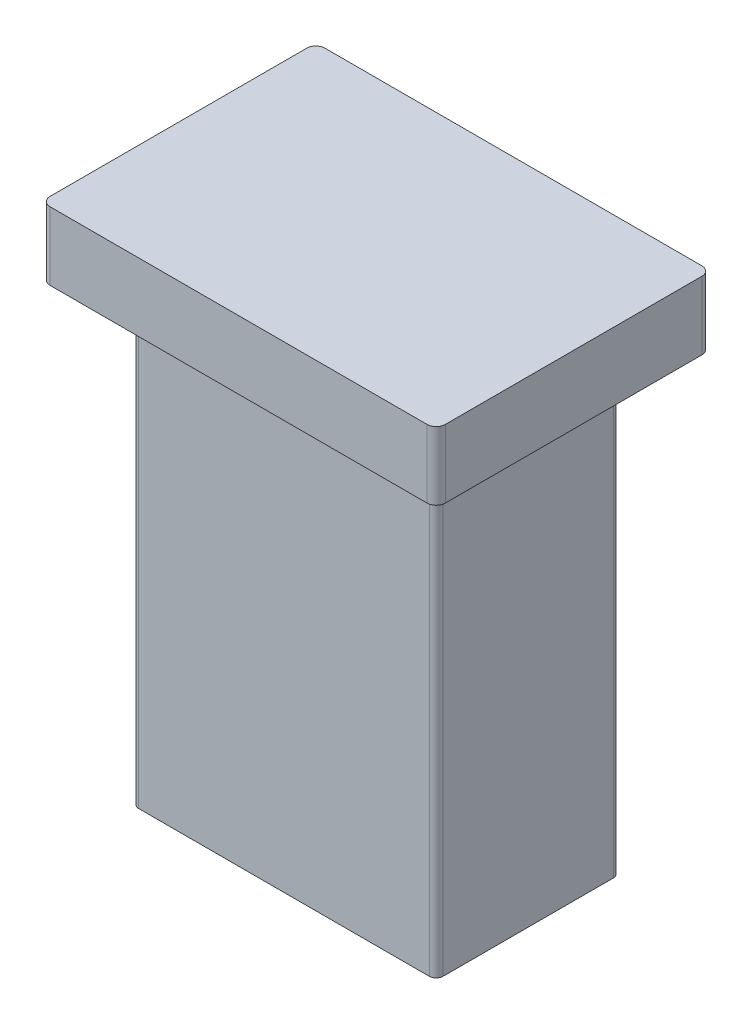
ISO-10303-21;
HEADER;
FILE_DESCRIPTION(('STEP AP214'),'2;1');
FILE_NAME('part.step','',(''),(''),'','','');
FILE_SCHEMA(('AUTOMOTIVE_DESIGN { 1 0 10303 214 1 1 1 1 }'));
ENDSEC;
DATA;
#1=APPLICATION_CONTEXT('core data for automotive mechanical design processes');
#2=APPLICATION_PROTOCOL_DEFINITION('international standard','automotive_design',2000,#1);
#3=PRODUCT_CONTEXT('',#1,'mechanical');
#4=PRODUCT('Part','Part','',(#3));
#5=PRODUCT_RELATED_PRODUCT_CATEGORY('part','',(#4));
#6=PRODUCT_DEFINITION_FORMATION('','',#4);
#7=PRODUCT_DEFINITION_CONTEXT('part definition',#1,'design');
#8=PRODUCT_DEFINITION('design','',#6,#7);
#9=PRODUCT_DEFINITION_SHAPE('','',#8);
#10=(LENGTH_UNIT() NAMED_UNIT(*) SI_UNIT(.MILLI.,.METRE.));
#11=(NAMED_UNIT(*) PLANE_ANGLE_UNIT() SI_UNIT($,.RADIAN.));
#12=(NAMED_UNIT(*) SI_UNIT($,.STERADIAN.) SOLID_ANGLE_UNIT());
#13=UNCERTAINTY_MEASURE_WITH_UNIT(LENGTH_MEASURE(1.E-05),#10,'distance_accuracy_value','');
#14=(GEOMETRIC_REPRESENTATION_CONTEXT(3) GLOBAL_UNCERTAINTY_ASSIGNED_CONTEXT((#13)) GLOBAL_UNIT_ASSIGNED_CONTEXT((#10,
#11,#12)) REPRESENTATION_CONTEXT('',''));
#15=CARTESIAN_POINT('',(0.,0.,0.));
#16=DIRECTION('',(0.,0.,1.));
#17=DIRECTION('',(1.,0.,0.));
#18=AXIS2_PLACEMENT_3D('',#15,#16,#17);
#19=CARTESIAN_POINT('',(-8.49999999999997,4.02455846426619E-13,5.25));
#20=DIRECTION('',(-1.,0.,0.));
#21=DIRECTION('',(0.,-1.,0.));
#22=AXIS2_PLACEMENT_3D('',#19,#20,#21);
#23=PLANE('',#22);
#24=DIRECTION('',(0.,-1.,0.));
#25=VECTOR('',#24,1.);
#26=CARTESIAN_POINT('',(-8.49999999999997,4.02455846426619E-13,3.75));
#27=LINE('',#26,#25);
#28=CARTESIAN_POINT('',(-8.50000000000071,-105.,3.75));
#29=VERTEX_POINT('',#28);
#30=CARTESIAN_POINT('',(-8.50000000000002,-6.99999999999994,3.75));
#31=VERTEX_POINT('',#30);
#32=EDGE_CURVE('E882',#29,#31,#27,.F.);
#33=ORIENTED_EDGE('',*,*,#32,.T.);
#34=DIRECTION('',(0.,0.,1.));
#35=VECTOR('',#34,1.);
#36=CARTESIAN_POINT('',(-8.50000000000002,-6.99999999999994,5.25));
#37=LINE('',#36,#35);
#38=CARTESIAN_POINT('',(-8.50000000000002,-6.99999999999994,-33.75));
#39=VERTEX_POINT('',#38);
#40=EDGE_CURVE('E485',#31,#39,#37,.F.);
#41=ORIENTED_EDGE('',*,*,#40,.T.);
#42=DIRECTION('',(0.,-1.,0.));
#43=VECTOR('',#42,1.);
#44=CARTESIAN_POINT('',(-8.49999999999997,4.02455846426619E-13,-33.75));
#45=LINE('',#44,#43);
#46=CARTESIAN_POINT('',(-8.50000000000071,-105.,-33.75));
#47=VERTEX_POINT('',#46);
#48=EDGE_CURVE('E879',#39,#47,#45,.T.);
#49=ORIENTED_EDGE('',*,*,#48,.T.);
#50=DIRECTION('',(0.,0.,-1.));
#51=VECTOR('',#50,1.);
#52=CARTESIAN_POINT('',(-8.50000000000071,-105.,5.25));
#53=LINE('',#52,#51);
#54=EDGE_CURVE('E909',#29,#47,#53,.T.);
#55=ORIENTED_EDGE('',*,*,#54,.F.);
#56=EDGE_LOOP('',(#33,#41,#49,#55));
#57=FACE_BOUND('',#56,.T.);
#58=ADVANCED_FACE('F49',(#57),#23,.T.);
#59=CARTESIAN_POINT('',(58.5,0.,5.25));
#60=DIRECTION('',(0.,0.,1.));
#61=DIRECTION('',(1.,0.,0.));
#62=AXIS2_PLACEMENT_3D('',#59,#60,#61);
#63=PLANE('',#62);
#64=DIRECTION('',(0.,-1.,0.));
#65=VECTOR('',#64,1.);
#66=CARTESIAN_POINT('',(57.,0.,5.25));
#67=LINE('',#66,#65);
#68=CARTESIAN_POINT('',(56.9999999999993,-105.,5.25));
#69=VERTEX_POINT('',#68);
#70=CARTESIAN_POINT('',(57.,-7.0000000000004,5.25));
#71=VERTEX_POINT('',#70);
#72=EDGE_CURVE('E849',#69,#71,#67,.F.);
#73=ORIENTED_EDGE('',*,*,#72,.T.);
#74=DIRECTION('',(1.,0.,0.));
#75=VECTOR('',#74,1.);
#76=CARTESIAN_POINT('',(58.5,-7.00000000000041,5.25));
#77=LINE('',#76,#75);
#78=CARTESIAN_POINT('',(-7.00000000000002,-6.99999999999995,5.25));
#79=VERTEX_POINT('',#78);
#80=EDGE_CURVE('E479',#71,#79,#77,.F.);
#81=ORIENTED_EDGE('',*,*,#80,.T.);
#82=DIRECTION('',(0.,-1.,0.));
#83=VECTOR('',#82,1.);
#84=CARTESIAN_POINT('',(-6.99999999999997,4.01872904157193E-13,5.25));
#85=LINE('',#84,#83);
#86=CARTESIAN_POINT('',(-7.00000000000071,-105.,5.25));
#87=VERTEX_POINT('',#86);
#88=EDGE_CURVE('E856',#79,#87,#85,.T.);
#89=ORIENTED_EDGE('',*,*,#88,.T.);
#90=DIRECTION('',(-1.,0.,0.));
#91=VECTOR('',#90,1.);
#92=CARTESIAN_POINT('',(58.4999999999993,-105.,5.25));
#93=LINE('',#92,#91);
#94=EDGE_CURVE('E854',#69,#87,#93,.T.);
#95=ORIENTED_EDGE('',*,*,#94,.F.);
#96=EDGE_LOOP('',(#73,#81,#89,#95));
#97=FACE_BOUND('',#96,.T.);
#98=ADVANCED_FACE('F344',(#97),#63,.T.);
#99=CARTESIAN_POINT('',(58.5,0.,5.25));
#100=DIRECTION('',(1.,0.,0.));
#101=DIRECTION('',(0.,1.,0.));
#102=AXIS2_PLACEMENT_3D('',#99,#100,#101);
#103=PLANE('',#102);
#104=DIRECTION('',(0.,-1.,0.));
#105=VECTOR('',#104,1.);
#106=CARTESIAN_POINT('',(58.5,0.,-33.75));
#107=LINE('',#106,#105);
#108=CARTESIAN_POINT('',(58.4999999999993,-105.,-33.75));
#109=VERTEX_POINT('',#108);
#110=CARTESIAN_POINT('',(58.5,-7.00000000000041,-33.75));
#111=VERTEX_POINT('',#110);
#112=EDGE_CURVE('E886',#109,#111,#107,.F.);
#113=ORIENTED_EDGE('',*,*,#112,.T.);
#114=DIRECTION('',(0.,0.,-1.));
#115=VECTOR('',#114,1.);
#116=CARTESIAN_POINT('',(58.5,-7.00000000000041,5.25));
#117=LINE('',#116,#115);
#118=CARTESIAN_POINT('',(58.5,-7.00000000000041,3.75));
#119=VERTEX_POINT('',#118);
#120=EDGE_CURVE('E473',#111,#119,#117,.F.);
#121=ORIENTED_EDGE('',*,*,#120,.T.);
#122=DIRECTION('',(0.,-1.,0.));
#123=VECTOR('',#122,1.);
#124=CARTESIAN_POINT('',(58.5,0.,3.75));
#125=LINE('',#124,#123);
#126=CARTESIAN_POINT('',(58.4999999999993,-105.,3.75));
#127=VERTEX_POINT('',#126);
#128=EDGE_CURVE('E850',#119,#127,#125,.T.);
#129=ORIENTED_EDGE('',*,*,#128,.T.);
#130=DIRECTION('',(0.,0.,1.));
#131=VECTOR('',#130,1.);
#132=CARTESIAN_POINT('',(58.4999999999993,-105.,5.25));
#133=LINE('',#132,#131);
#134=EDGE_CURVE('E862',#109,#127,#133,.T.);
#135=ORIENTED_EDGE('',*,*,#134,.F.);
#136=EDGE_LOOP('',(#113,#121,#129,#135));
#137=FACE_BOUND('',#136,.T.);
#138=ADVANCED_FACE('F347',(#137),#103,.T.);
#139=CARTESIAN_POINT('',(58.5,0.,-35.25));
#140=DIRECTION('',(0.,0.,-1.));
#141=DIRECTION('',(-1.,0.,0.));
#142=AXIS2_PLACEMENT_3D('',#139,#140,#141);
#143=PLANE('',#142);
#144=DIRECTION('',(0.,-1.,0.));
#145=VECTOR('',#144,1.);
#146=CARTESIAN_POINT('',(-6.99999999999996,4.01872904157193E-13,-35.25));
#147=LINE('',#146,#145);
#148=CARTESIAN_POINT('',(-7.00000000000071,-105.,-35.25));
#149=VERTEX_POINT('',#148);
#150=CARTESIAN_POINT('',(-7.00000000000001,-6.99999999999995,-35.25));
#151=VERTEX_POINT('',#150);
#152=EDGE_CURVE('E892',#149,#151,#147,.F.);
#153=ORIENTED_EDGE('',*,*,#152,.T.);
#154=DIRECTION('',(-1.,0.,0.));
#155=VECTOR('',#154,1.);
#156=CARTESIAN_POINT('',(58.5,-7.00000000000041,-35.25));
#157=LINE('',#156,#155);
#158=CARTESIAN_POINT('',(57.,-7.0000000000004,-35.25));
#159=VERTEX_POINT('',#158);
#160=EDGE_CURVE('E514',#151,#159,#157,.F.);
#161=ORIENTED_EDGE('',*,*,#160,.T.);
#162=DIRECTION('',(0.,-1.,0.));
#163=VECTOR('',#162,1.);
#164=CARTESIAN_POINT('',(57.,0.,-35.25));
#165=LINE('',#164,#163);
#166=CARTESIAN_POINT('',(56.9999999999993,-105.,-35.25));
#167=VERTEX_POINT('',#166);
#168=EDGE_CURVE('E438',#159,#167,#165,.T.);
#169=ORIENTED_EDGE('',*,*,#168,.T.);
#170=DIRECTION('',(1.,0.,0.));
#171=VECTOR('',#170,1.);
#172=CARTESIAN_POINT('',(58.4999999999993,-105.,-35.25));
#173=LINE('',#172,#171);
#174=EDGE_CURVE('E900',#149,#167,#173,.T.);
#175=ORIENTED_EDGE('',*,*,#174,.F.);
#176=EDGE_LOOP('',(#153,#161,#169,#175));
#177=FACE_BOUND('',#176,.T.);
#178=ADVANCED_FACE('F342',(#177),#143,.T.);
#179=CARTESIAN_POINT('',(-7.17709473941449E-13,-105.,0.));
#180=DIRECTION('',(0.,1.,0.));
#181=DIRECTION('',(-1.,0.,0.));
#182=AXIS2_PLACEMENT_3D('',#179,#180,#181);
#183=PLANE('',#182);
#184=DIRECTION('',(1.,0.,0.));
#185=VECTOR('',#184,1.);
#186=CARTESIAN_POINT('',(-7.00000000000073,-105.,-33.75));
#187=LINE('',#186,#185);
#188=CARTESIAN_POINT('',(-7.00000000000073,-105.,-33.75));
#189=VERTEX_POINT('',#188);
#190=CARTESIAN_POINT('',(56.9999999999993,-105.,-33.75));
#191=VERTEX_POINT('',#190);
#192=EDGE_CURVE('E914',#189,#191,#187,.T.);
#193=ORIENTED_EDGE('',*,*,#192,.F.);
#194=DIRECTION('',(0.,0.,-1.));
#195=VECTOR('',#194,1.);
#196=CARTESIAN_POINT('',(-7.00000000000073,-105.,-33.75));
#197=LINE('',#196,#195);
#198=CARTESIAN_POINT('',(-7.00000000000073,-105.,3.74999999999999));
#199=VERTEX_POINT('',#198);
#200=EDGE_CURVE('E925',#199,#189,#197,.T.);
#201=ORIENTED_EDGE('',*,*,#200,.F.);
#202=DIRECTION('',(-1.,0.,0.));
#203=VECTOR('',#202,1.);
#204=CARTESIAN_POINT('',(-7.00000000000073,-105.,3.74999999999999));
#205=LINE('',#204,#203);
#206=CARTESIAN_POINT('',(56.9999999999993,-105.,3.75));
#207=VERTEX_POINT('',#206);
#208=EDGE_CURVE('E236',#207,#199,#205,.T.);
#209=ORIENTED_EDGE('',*,*,#208,.F.);
#210=DIRECTION('',(0.,0.,1.));
#211=VECTOR('',#210,1.);
#212=CARTESIAN_POINT('',(56.9999999999993,-105.,-33.75));
#213=LINE('',#212,#211);
#214=EDGE_CURVE('E918',#191,#207,#213,.T.);
#215=ORIENTED_EDGE('',*,*,#214,.F.);
#216=EDGE_LOOP('',(#193,#201,#209,#215));
#217=FACE_BOUND('',#216,.T.);
#218=ORIENTED_EDGE('',*,*,#94,.T.);
#219=CARTESIAN_POINT('',(-7.0000000000007,-105.,3.75));
#220=DIRECTION('',(0.,1.,0.));
#221=DIRECTION('',(-1.,0.,0.));
#222=AXIS2_PLACEMENT_3D('',#219,#220,#221);
#223=CIRCLE('',#222,1.5);
#224=EDGE_CURVE('E876',#87,#29,#223,.F.);
#225=ORIENTED_EDGE('',*,*,#224,.T.);
#226=ORIENTED_EDGE('',*,*,#54,.T.);
#227=CARTESIAN_POINT('',(-7.0000000000007,-105.,-33.75));
#228=DIRECTION('',(0.,1.,0.));
#229=DIRECTION('',(-1.,0.,0.));
#230=AXIS2_PLACEMENT_3D('',#227,#228,#229);
#231=CIRCLE('',#230,1.5);
#232=EDGE_CURVE('E860',#47,#149,#231,.F.);
#233=ORIENTED_EDGE('',*,*,#232,.T.);
#234=ORIENTED_EDGE('',*,*,#174,.T.);
#235=CARTESIAN_POINT('',(56.9999999999993,-105.,-33.75));
#236=DIRECTION('',(0.,1.,0.));
#237=DIRECTION('',(-1.,0.,0.));
#238=AXIS2_PLACEMENT_3D('',#235,#236,#237);
#239=CIRCLE('',#238,1.5);
#240=EDGE_CURVE('E870',#167,#109,#239,.F.);
#241=ORIENTED_EDGE('',*,*,#240,.T.);
#242=ORIENTED_EDGE('',*,*,#134,.T.);
#243=CARTESIAN_POINT('',(56.9999999999993,-105.,3.75));
#244=DIRECTION('',(0.,1.,0.));
#245=DIRECTION('',(-1.,0.,0.));
#246=AXIS2_PLACEMENT_3D('',#243,#244,#245);
#247=CIRCLE('',#246,1.5);
#248=EDGE_CURVE('E873',#127,#69,#247,.F.);
#249=ORIENTED_EDGE('',*,*,#248,.T.);
#250=EDGE_LOOP('',(#218,#225,#226,#233,#234,#241,#242,#249));
#251=FACE_BOUND('',#250,.T.);
#252=ADVANCED_FACE('F272',(#217,#251),#183,.F.);
#253=CARTESIAN_POINT('',(0.,0.,0.));
#254=CARTESIAN_POINT('',(-2.61921824104236,-3.17616720955481,1.47627578718784));
#255=CARTESIAN_POINT('',(-8.18445347407178,-20.4129286031587,4.53132616889324));
#256=CARTESIAN_POINT('',(-4.85989916303547,-50.2491120364394,2.35522903024389));
#257=CARTESIAN_POINT('',(-7.2377355034017,-81.6238908082817,3.55458602145176));
#258=CARTESIAN_POINT('',(-7.13327503643624,-98.3304184884447,3.68328961066001));
#259=CARTESIAN_POINT('',(-7.00000000000073,-105.,3.75));
#260=CARTESIAN_POINT('',(0.,0.,-10.));
#261=CARTESIAN_POINT('',(-2.61921824104236,-3.17616720955481,-9.50790807093738));
#262=CARTESIAN_POINT('',(-8.18445347407178,-20.4129286031587,-8.48955794370225));
#263=CARTESIAN_POINT('',(-4.85989916303547,-50.2491120364394,-9.21492365658538));
#264=CARTESIAN_POINT('',(-7.2377355034017,-81.6238908082817,-8.81513799284942));
#265=CARTESIAN_POINT('',(-7.13327503643624,-98.3304184884447,-8.77223679644666));
#266=CARTESIAN_POINT('',(-7.00000000000073,-105.,-8.75));
#267=CARTESIAN_POINT('',(0.,0.,-20.));
#268=CARTESIAN_POINT('',(-2.61921824104236,-3.17616720955481,-20.4920919290626));
#269=CARTESIAN_POINT('',(-8.18445347407177,-20.4129286031587,-21.5104420562977));
#270=CARTESIAN_POINT('',(-4.85989916303547,-50.2491120364394,-20.7850763434146));
#271=CARTESIAN_POINT('',(-7.23773550340169,-81.6238908082817,-21.1848620071506));
#272=CARTESIAN_POINT('',(-7.13327503643624,-98.3304184884447,-21.2277632035533));
#273=CARTESIAN_POINT('',(-7.00000000000073,-105.,-21.25));
#274=CARTESIAN_POINT('',(0.,0.,-30.));
#275=CARTESIAN_POINT('',(-2.61921824104236,-3.17616720955481,-31.4762757871878));
#276=CARTESIAN_POINT('',(-8.18445347407177,-20.4129286031587,-34.5313261688932));
#277=CARTESIAN_POINT('',(-4.85989916303547,-50.2491120364394,-32.3552290302439));
#278=CARTESIAN_POINT('',(-7.2377355034017,-81.6238908082817,-33.5545860214518));
#279=CARTESIAN_POINT('',(-7.13327503643623,-98.3304184884447,-33.68328961066));
#280=CARTESIAN_POINT('',(-7.00000000000073,-105.,-33.75));
#281=B_SPLINE_SURFACE_WITH_KNOTS('',3,3,((#253,#254,#255,#256,#257,#258,#259),(#260,#261,#262,
#263,#264,#265,#266),(#267,#268,#269,#270,#271,#272,#273),(#274,#275,#276,#277,#278,#279,#280)),
.UNSPECIFIED.,.F.,.F.,.F.,(4,4),(4,1,1,1,4),(0.,1.),(0.,0.103246401573327,0.528052801243238,
0.811273441540462,1.),.UNSPECIFIED.);
#282=DIRECTION('',(0.,0.,1.));
#283=VECTOR('',#282,1.);
#284=CARTESIAN_POINT('',(0.,0.,0.));
#285=LINE('',#284,#283);
#286=CARTESIAN_POINT('',(0.,0.,-30.));
#287=VERTEX_POINT('',#286);
#288=CARTESIAN_POINT('',(0.,0.,0.));
#289=VERTEX_POINT('',#288);
#290=EDGE_CURVE('E218',#287,#289,#285,.T.);
#291=CARTESIAN_POINT('',(0.,0.,0.));
#292=CARTESIAN_POINT('',(-2.61921824104236,-3.17616720955481,1.47627578718784));
#293=CARTESIAN_POINT('',(-8.18445347407178,-20.4129286031587,4.53132616889324));
#294=CARTESIAN_POINT('',(-4.85989916303547,-50.2491120364394,2.35522903024389));
#295=CARTESIAN_POINT('',(-7.2377355034017,-81.6238908082817,3.55458602145176));
#296=CARTESIAN_POINT('',(-7.13327503643624,-98.3304184884447,3.68328961066001));
#297=CARTESIAN_POINT('',(-7.00000000000073,-105.,3.75));
#298=B_SPLINE_CURVE_WITH_KNOTS('',3,(#291,#292,#293,#294,#295,#296,#297),.UNSPECIFIED.,.F.,.F.,
(4,1,1,1,4),(0.,0.103246401573327,0.528052801243238,0.811273441540462,1.),.UNSPECIFIED.);
#299=EDGE_CURVE('E229',#199,#289,#298,.F.);
#300=CARTESIAN_POINT('',(0.,0.,-30.));
#301=CARTESIAN_POINT('',(-2.61921824104236,-3.17616720955481,-31.4762757871878));
#302=CARTESIAN_POINT('',(-8.18445347407177,-20.4129286031587,-34.5313261688932));
#303=CARTESIAN_POINT('',(-4.85989916303547,-50.2491120364394,-32.3552290302439));
#304=CARTESIAN_POINT('',(-7.2377355034017,-81.6238908082817,-33.5545860214518));
#305=CARTESIAN_POINT('',(-7.13327503643623,-98.3304184884447,-33.68328961066));
#306=CARTESIAN_POINT('',(-7.00000000000073,-105.,-33.75));
#307=B_SPLINE_CURVE_WITH_KNOTS('',3,(#300,#301,#302,#303,#304,#305,#306),.UNSPECIFIED.,.F.,.F.,
(4,1,1,1,4),(0.,0.103246401573327,0.528052801243238,0.811273441540462,1.),.UNSPECIFIED.);
#308=EDGE_CURVE('E241',#287,#189,#307,.T.);
#309=ORIENTED_EDGE('',*,*,#290,.T.);
#310=ORIENTED_EDGE('',*,*,#299,.F.);
#311=ORIENTED_EDGE('',*,*,#200,.T.);
#312=ORIENTED_EDGE('',*,*,#308,.F.);
#313=EDGE_LOOP('',(#309,#310,#311,#312));
#314=FACE_BOUND('',#313,.T.);
#315=ADVANCED_FACE('F245',(#314),#281,.F.);
#316=CARTESIAN_POINT('',(0.,0.,-30.));
#317=CARTESIAN_POINT('',(-2.61921824104236,-3.17616720955481,-31.4762757871878));
#318=CARTESIAN_POINT('',(-8.18445347407177,-20.4129286031587,-34.5313261688932));
#319=CARTESIAN_POINT('',(-4.85989916303547,-50.2491120364394,-32.3552290302439));
#320=CARTESIAN_POINT('',(-7.23773550340169,-81.6238908082817,-33.5545860214518));
#321=CARTESIAN_POINT('',(-7.13327503643623,-98.3304184884447,-33.68328961066));
#322=CARTESIAN_POINT('',(-7.00000000000073,-105.,-33.75));
#323=CARTESIAN_POINT('',(16.6666666666667,0.,-30.));
#324=CARTESIAN_POINT('',(15.7935939196525,-3.17616720955487,-31.4762757871878));
#325=CARTESIAN_POINT('',(13.9385155086427,-20.412928603159,-34.5313261688932));
#326=CARTESIAN_POINT('',(15.0467002789879,-50.2491120364395,-32.3552290302439));
#327=CARTESIAN_POINT('',(14.2540881655324,-81.6238908082818,-33.5545860214518));
#328=CARTESIAN_POINT('',(14.2889083211875,-98.3304184884448,-33.68328961066));
#329=CARTESIAN_POINT('',(14.3333333333326,-105.,-33.75));
#330=CARTESIAN_POINT('',(33.3333333333333,0.,-30.));
#331=CARTESIAN_POINT('',(34.2064060803474,-3.17616720955492,-31.4762757871878));
#332=CARTESIAN_POINT('',(36.0614844913571,-20.4129286031593,-34.5313261688932));
#333=CARTESIAN_POINT('',(34.9532997210113,-50.2491120364395,-32.3552290302439));
#334=CARTESIAN_POINT('',(35.7459118344665,-81.623890808282,-33.5545860214518));
#335=CARTESIAN_POINT('',(35.7110916788112,-98.330418488445,-33.68328961066));
#336=CARTESIAN_POINT('',(35.6666666666659,-105.,-33.75));
#337=CARTESIAN_POINT('',(50.,0.,-30.));
#338=CARTESIAN_POINT('',(52.6192182410423,-3.17616720955497,-31.4762757871878));
#339=CARTESIAN_POINT('',(58.1844534740715,-20.4129286031596,-34.5313261688932));
#340=CARTESIAN_POINT('',(54.8598991630347,-50.2491120364397,-32.3552290302439));
#341=CARTESIAN_POINT('',(57.2377355034006,-81.6238908082822,-33.5545860214518));
#342=CARTESIAN_POINT('',(57.1332750364349,-98.3304184884451,-33.68328961066));
#343=CARTESIAN_POINT('',(56.9999999999993,-105.,-33.75));
#344=B_SPLINE_SURFACE_WITH_KNOTS('',3,3,((#316,#317,#318,#319,#320,#321,#322),(#323,#324,#325,
#326,#327,#328,#329),(#330,#331,#332,#333,#334,#335,#336),(#337,#338,#339,#340,#341,#342,#343)),
.UNSPECIFIED.,.F.,.F.,.F.,(4,4),(4,1,1,1,4),(0.,1.),(0.,0.103246401573327,0.528052801243238,
0.811273441540462,1.),.UNSPECIFIED.);
#345=DIRECTION('',(-1.,0.,0.));
#346=VECTOR('',#345,1.);
#347=CARTESIAN_POINT('',(0.,0.,-30.));
#348=LINE('',#347,#346);
#349=CARTESIAN_POINT('',(50.,-3.52122974228128E-13,-30.));
#350=VERTEX_POINT('',#349);
#351=EDGE_CURVE('E247',#350,#287,#348,.T.);
#352=CARTESIAN_POINT('',(50.,0.,-30.));
#353=CARTESIAN_POINT('',(52.6192182410423,-3.17616720955497,-31.4762757871878));
#354=CARTESIAN_POINT('',(58.1844534740715,-20.4129286031596,-34.5313261688932));
#355=CARTESIAN_POINT('',(54.8598991630347,-50.2491120364397,-32.3552290302439));
#356=CARTESIAN_POINT('',(57.2377355034006,-81.6238908082822,-33.5545860214518));
#357=CARTESIAN_POINT('',(57.1332750364349,-98.3304184884451,-33.68328961066));
#358=CARTESIAN_POINT('',(56.9999999999993,-105.,-33.75));
#359=B_SPLINE_CURVE_WITH_KNOTS('',3,(#352,#353,#354,#355,#356,#357,#358),.UNSPECIFIED.,.F.,.F.,
(4,1,1,1,4),(0.,0.103246401573327,0.528052801243238,0.811273441540462,1.),.UNSPECIFIED.);
#360=EDGE_CURVE('E300',#350,#191,#359,.T.);
#361=ORIENTED_EDGE('',*,*,#351,.T.);
#362=ORIENTED_EDGE('',*,*,#308,.T.);
#363=ORIENTED_EDGE('',*,*,#192,.T.);
#364=ORIENTED_EDGE('',*,*,#360,.F.);
#365=EDGE_LOOP('',(#361,#362,#363,#364));
#366=FACE_BOUND('',#365,.T.);
#367=ADVANCED_FACE('F271',(#366),#344,.F.);
#368=CARTESIAN_POINT('',(50.,0.,0.));
#369=CARTESIAN_POINT('',(52.6192182410423,-3.17616720955497,1.47627578718784));
#370=CARTESIAN_POINT('',(58.1844534740715,-20.4129286031596,4.53132616889324));
#371=CARTESIAN_POINT('',(54.8598991630347,-50.2491120364397,2.3552290302439));
#372=CARTESIAN_POINT('',(57.2377355034006,-81.6238908082822,3.55458602145175));
#373=CARTESIAN_POINT('',(57.1332750364349,-98.3304184884451,3.68328961066));
#374=CARTESIAN_POINT('',(56.9999999999993,-105.,3.75));
#375=CARTESIAN_POINT('',(33.3333333333333,0.,0.));
#376=CARTESIAN_POINT('',(34.2064060803474,-3.17616720955492,1.47627578718784));
#377=CARTESIAN_POINT('',(36.0614844913571,-20.4129286031593,4.53132616889324));
#378=CARTESIAN_POINT('',(34.9532997210113,-50.2491120364396,2.35522903024389));
#379=CARTESIAN_POINT('',(35.7459118344665,-81.623890808282,3.55458602145175));
#380=CARTESIAN_POINT('',(35.7110916788112,-98.330418488445,3.68328961066));
#381=CARTESIAN_POINT('',(35.6666666666659,-105.,3.75));
#382=CARTESIAN_POINT('',(16.6666666666667,0.,0.));
#383=CARTESIAN_POINT('',(15.7935939196525,-3.17616720955487,1.47627578718784));
#384=CARTESIAN_POINT('',(13.9385155086427,-20.412928603159,4.53132616889324));
#385=CARTESIAN_POINT('',(15.0467002789879,-50.2491120364395,2.35522903024389));
#386=CARTESIAN_POINT('',(14.2540881655324,-81.6238908082818,3.55458602145176));
#387=CARTESIAN_POINT('',(14.2889083211875,-98.3304184884448,3.68328961066));
#388=CARTESIAN_POINT('',(14.3333333333326,-105.,3.75));
#389=CARTESIAN_POINT('',(0.,0.,0.));
#390=CARTESIAN_POINT('',(-2.61921824104236,-3.17616720955481,1.47627578718784));
#391=CARTESIAN_POINT('',(-8.18445347407178,-20.4129286031587,4.53132616889324));
#392=CARTESIAN_POINT('',(-4.85989916303547,-50.2491120364394,2.35522903024389));
#393=CARTESIAN_POINT('',(-7.2377355034017,-81.6238908082817,3.55458602145176));
#394=CARTESIAN_POINT('',(-7.13327503643624,-98.3304184884447,3.68328961066));
#395=CARTESIAN_POINT('',(-7.00000000000073,-105.,3.74999999999999));
#396=B_SPLINE_SURFACE_WITH_KNOTS('',3,3,((#368,#369,#370,#371,#372,#373,#374),(#375,#376,#377,
#378,#379,#380,#381),(#382,#383,#384,#385,#386,#387,#388),(#389,#390,#391,#392,#393,#394,#395)),
.UNSPECIFIED.,.F.,.F.,.F.,(4,4),(4,1,1,1,4),(0.,1.),(0.,0.103246401573327,0.528052801243238,
0.811273441540462,1.),.UNSPECIFIED.);
#397=DIRECTION('',(1.,0.,0.));
#398=VECTOR('',#397,1.);
#399=CARTESIAN_POINT('',(0.,0.,0.));
#400=LINE('',#399,#398);
#401=CARTESIAN_POINT('',(50.,0.,0.));
#402=VERTEX_POINT('',#401);
#403=EDGE_CURVE('E213',#289,#402,#400,.T.);
#404=CARTESIAN_POINT('',(50.,0.,0.));
#405=CARTESIAN_POINT('',(52.6192182410423,-3.17616720955497,1.47627578718784));
#406=CARTESIAN_POINT('',(58.1844534740715,-20.4129286031596,4.53132616889325));
#407=CARTESIAN_POINT('',(54.8598991630347,-50.2491120364397,2.3552290302439));
#408=CARTESIAN_POINT('',(57.2377355034006,-81.6238908082822,3.55458602145175));
#409=CARTESIAN_POINT('',(57.1332750364349,-98.3304184884451,3.68328961066001));
#410=CARTESIAN_POINT('',(56.9999999999993,-105.,3.75));
#411=B_SPLINE_CURVE_WITH_KNOTS('',3,(#404,#405,#406,#407,#408,#409,#410),.UNSPECIFIED.,.F.,.F.,
(4,1,1,1,4),(0.,0.103246401573327,0.528052801243238,0.811273441540462,1.),.UNSPECIFIED.);
#412=EDGE_CURVE('E308',#402,#207,#411,.T.);
#413=ORIENTED_EDGE('',*,*,#403,.T.);
#414=ORIENTED_EDGE('',*,*,#412,.T.);
#415=ORIENTED_EDGE('',*,*,#208,.T.);
#416=ORIENTED_EDGE('',*,*,#299,.T.);
#417=EDGE_LOOP('',(#413,#414,#415,#416));
#418=FACE_BOUND('',#417,.T.);
#419=ADVANCED_FACE('F234',(#418),#396,.F.);
#420=CARTESIAN_POINT('',(50.,0.,-30.));
#421=CARTESIAN_POINT('',(52.6192182410423,-3.17616720955497,-31.4762757871878));
#422=CARTESIAN_POINT('',(58.1844534740715,-20.4129286031596,-34.5313261688932));
#423=CARTESIAN_POINT('',(54.8598991630347,-50.2491120364397,-32.3552290302439));
#424=CARTESIAN_POINT('',(57.2377355034006,-81.6238908082822,-33.5545860214518));
#425=CARTESIAN_POINT('',(57.1332750364349,-98.3304184884451,-33.68328961066));
#426=CARTESIAN_POINT('',(56.9999999999993,-105.,-33.75));
#427=CARTESIAN_POINT('',(50.,0.,-20.));
#428=CARTESIAN_POINT('',(52.6192182410423,-3.17616720955497,-20.4920919290626));
#429=CARTESIAN_POINT('',(58.1844534740715,-20.4129286031596,-21.5104420562977));
#430=CARTESIAN_POINT('',(54.8598991630347,-50.2491120364397,-20.7850763434146));
#431=CARTESIAN_POINT('',(57.2377355034006,-81.6238908082822,-21.1848620071506));
#432=CARTESIAN_POINT('',(57.1332750364349,-98.3304184884451,-21.2277632035533));
#433=CARTESIAN_POINT('',(56.9999999999993,-105.,-21.25));
#434=CARTESIAN_POINT('',(50.,0.,-10.));
#435=CARTESIAN_POINT('',(52.6192182410423,-3.17616720955497,-9.50790807093739));
#436=CARTESIAN_POINT('',(58.1844534740715,-20.4129286031596,-8.48955794370225));
#437=CARTESIAN_POINT('',(54.8598991630347,-50.2491120364397,-9.21492365658537));
#438=CARTESIAN_POINT('',(57.2377355034006,-81.6238908082822,-8.81513799284942));
#439=CARTESIAN_POINT('',(57.1332750364349,-98.3304184884451,-8.77223679644666));
#440=CARTESIAN_POINT('',(56.9999999999993,-105.,-8.75));
#441=CARTESIAN_POINT('',(50.,0.,0.));
#442=CARTESIAN_POINT('',(52.6192182410423,-3.17616720955497,1.47627578718784));
#443=CARTESIAN_POINT('',(58.1844534740715,-20.4129286031596,4.53132616889325));
#444=CARTESIAN_POINT('',(54.8598991630347,-50.2491120364397,2.3552290302439));
#445=CARTESIAN_POINT('',(57.2377355034006,-81.6238908082822,3.55458602145175));
#446=CARTESIAN_POINT('',(57.1332750364349,-98.3304184884451,3.68328961066001));
#447=CARTESIAN_POINT('',(56.9999999999993,-105.,3.75));
#448=B_SPLINE_SURFACE_WITH_KNOTS('',3,3,((#420,#421,#422,#423,#424,#425,#426),(#427,#428,#429,
#430,#431,#432,#433),(#434,#435,#436,#437,#438,#439,#440),(#441,#442,#443,#444,#445,#446,#447)),
.UNSPECIFIED.,.F.,.F.,.F.,(4,4),(4,1,1,1,4),(0.,1.),(0.,0.103246401573327,0.528052801243238,
0.811273441540462,1.),.UNSPECIFIED.);
#449=DIRECTION('',(0.,0.,-1.));
#450=VECTOR('',#449,1.);
#451=CARTESIAN_POINT('',(50.,0.,0.));
#452=LINE('',#451,#450);
#453=EDGE_CURVE('E222',#402,#350,#452,.T.);
#454=ORIENTED_EDGE('',*,*,#453,.T.);
#455=ORIENTED_EDGE('',*,*,#360,.T.);
#456=ORIENTED_EDGE('',*,*,#214,.T.);
#457=ORIENTED_EDGE('',*,*,#412,.F.);
#458=EDGE_LOOP('',(#454,#455,#456,#457));
#459=FACE_BOUND('',#458,.T.);
#460=ADVANCED_FACE('F324',(#459),#448,.F.);
#461=CARTESIAN_POINT('',(0.,0.,0.));
#462=DIRECTION('',(0.,1.,0.));
#463=DIRECTION('',(-1.,0.,0.));
#464=AXIS2_PLACEMENT_3D('',#461,#462,#463);
#465=PLANE('',#464);
#466=ORIENTED_EDGE('',*,*,#403,.F.);
#467=ORIENTED_EDGE('',*,*,#290,.F.);
#468=ORIENTED_EDGE('',*,*,#351,.F.);
#469=ORIENTED_EDGE('',*,*,#453,.F.);
#470=EDGE_LOOP('',(#466,#467,#468,#469));
#471=FACE_BOUND('',#470,.T.);
#472=ADVANCED_FACE('F216',(#471),#465,.F.);
#473=CARTESIAN_POINT('',(68.5,-5.00000000000048,15.25));
#474=DIRECTION('',(1.,0.,0.));
#475=DIRECTION('',(0.,1.,0.));
#476=AXIS2_PLACEMENT_3D('',#473,#474,#475);
#477=PLANE('',#476);
#478=DIRECTION('',(0.,0.,-1.));
#479=VECTOR('',#478,1.);
#480=CARTESIAN_POINT('',(68.5000000000001,9.99999999999952,15.25));
#481=LINE('',#480,#479);
#482=CARTESIAN_POINT('',(68.5000000000001,9.99999999999952,13.25));
#483=VERTEX_POINT('',#482);
#484=CARTESIAN_POINT('',(68.5000000000001,9.99999999999952,-43.25));
#485=VERTEX_POINT('',#484);
#486=EDGE_CURVE('E554',#483,#485,#481,.T.);
#487=ORIENTED_EDGE('',*,*,#486,.F.);
#488=DIRECTION('',(0.,1.,0.));
#489=VECTOR('',#488,1.);
#490=CARTESIAN_POINT('',(68.5,-5.00000000000048,13.25));
#491=LINE('',#490,#489);
#492=CARTESIAN_POINT('',(68.5,-5.00000000000048,13.25));
#493=VERTEX_POINT('',#492);
#494=EDGE_CURVE('E519',#483,#493,#491,.F.);
#495=ORIENTED_EDGE('',*,*,#494,.T.);
#496=DIRECTION('',(0.,0.,-1.));
#497=VECTOR('',#496,1.);
#498=CARTESIAN_POINT('',(68.5,-5.00000000000048,15.25));
#499=LINE('',#498,#497);
#500=CARTESIAN_POINT('',(68.5,-5.00000000000048,-43.25));
#501=VERTEX_POINT('',#500);
#502=EDGE_CURVE('E573',#493,#501,#499,.T.);
#503=ORIENTED_EDGE('',*,*,#502,.T.);
#504=DIRECTION('',(0.,1.,0.));
#505=VECTOR('',#504,1.);
#506=CARTESIAN_POINT('',(68.5,-5.00000000000048,-43.25));
#507=LINE('',#506,#505);
#508=EDGE_CURVE('E425',#501,#485,#507,.T.);
#509=ORIENTED_EDGE('',*,*,#508,.T.);
#510=EDGE_LOOP('',(#487,#495,#503,#509));
#511=FACE_BOUND('',#510,.T.);
#512=ADVANCED_FACE('F610',(#511),#477,.T.);
#513=CARTESIAN_POINT('',(-18.5,-4.99999999999987,15.25));
#514=DIRECTION('',(0.,0.,1.));
#515=DIRECTION('',(1.,0.,0.));
#516=AXIS2_PLACEMENT_3D('',#513,#514,#515);
#517=PLANE('',#516);
#518=DIRECTION('',(1.,0.,0.));
#519=VECTOR('',#518,1.);
#520=CARTESIAN_POINT('',(-18.4999999999999,10.0000000000001,15.25));
#521=LINE('',#520,#519);
#522=CARTESIAN_POINT('',(-16.4999999999999,10.0000000000001,15.25));
#523=VERTEX_POINT('',#522);
#524=CARTESIAN_POINT('',(66.5000000000001,9.99999999999953,15.25));
#525=VERTEX_POINT('',#524);
#526=EDGE_CURVE('E571',#523,#525,#521,.T.);
#527=ORIENTED_EDGE('',*,*,#526,.F.);
#528=DIRECTION('',(0.,1.,0.));
#529=VECTOR('',#528,1.);
#530=CARTESIAN_POINT('',(-16.5,-4.99999999999988,15.25));
#531=LINE('',#530,#529);
#532=CARTESIAN_POINT('',(-16.5,-4.99999999999988,15.25));
#533=VERTEX_POINT('',#532);
#534=EDGE_CURVE('E511',#523,#533,#531,.F.);
#535=ORIENTED_EDGE('',*,*,#534,.T.);
#536=DIRECTION('',(1.,0.,0.));
#537=VECTOR('',#536,1.);
#538=CARTESIAN_POINT('',(-18.5,-4.99999999999987,15.25));
#539=LINE('',#538,#537);
#540=CARTESIAN_POINT('',(66.5,-5.00000000000047,15.25));
#541=VERTEX_POINT('',#540);
#542=EDGE_CURVE('E248',#533,#541,#539,.T.);
#543=ORIENTED_EDGE('',*,*,#542,.T.);
#544=DIRECTION('',(0.,1.,0.));
#545=VECTOR('',#544,1.);
#546=CARTESIAN_POINT('',(66.5,-5.00000000000047,15.25));
#547=LINE('',#546,#545);
#548=EDGE_CURVE('E508',#541,#525,#547,.T.);
#549=ORIENTED_EDGE('',*,*,#548,.T.);
#550=EDGE_LOOP('',(#527,#535,#543,#549));
#551=FACE_BOUND('',#550,.T.);
#552=ADVANCED_FACE('F591',(#551),#517,.T.);
#553=CARTESIAN_POINT('',(-18.5,-4.99999999999987,-45.25));
#554=DIRECTION('',(-1.,0.,0.));
#555=DIRECTION('',(0.,-1.,0.));
#556=AXIS2_PLACEMENT_3D('',#553,#554,#555);
#557=PLANE('',#556);
#558=DIRECTION('',(0.,0.,1.));
#559=VECTOR('',#558,1.);
#560=CARTESIAN_POINT('',(-18.5,-4.99999999999987,-45.25));
#561=LINE('',#560,#559);
#562=CARTESIAN_POINT('',(-18.5,-4.99999999999987,-43.25));
#563=VERTEX_POINT('',#562);
#564=CARTESIAN_POINT('',(-18.5,-4.99999999999987,13.25));
#565=VERTEX_POINT('',#564);
#566=EDGE_CURVE('E580',#563,#565,#561,.T.);
#567=ORIENTED_EDGE('',*,*,#566,.T.);
#568=DIRECTION('',(0.,1.,0.));
#569=VECTOR('',#568,1.);
#570=CARTESIAN_POINT('',(-18.5,-4.99999999999987,13.25));
#571=LINE('',#570,#569);
#572=CARTESIAN_POINT('',(-18.4999999999999,10.0000000000001,13.25));
#573=VERTEX_POINT('',#572);
#574=EDGE_CURVE('E494',#565,#573,#571,.T.);
#575=ORIENTED_EDGE('',*,*,#574,.T.);
#576=DIRECTION('',(0.,0.,1.));
#577=VECTOR('',#576,1.);
#578=CARTESIAN_POINT('',(-18.4999999999999,10.0000000000001,-45.25));
#579=LINE('',#578,#577);
#580=CARTESIAN_POINT('',(-18.4999999999999,10.0000000000001,-43.25));
#581=VERTEX_POINT('',#580);
#582=EDGE_CURVE('E565',#581,#573,#579,.T.);
#583=ORIENTED_EDGE('',*,*,#582,.F.);
#584=DIRECTION('',(0.,1.,0.));
#585=VECTOR('',#584,1.);
#586=CARTESIAN_POINT('',(-18.5,-4.99999999999987,-43.25));
#587=LINE('',#586,#585);
#588=EDGE_CURVE('E491',#581,#563,#587,.F.);
#589=ORIENTED_EDGE('',*,*,#588,.T.);
#590=EDGE_LOOP('',(#567,#575,#583,#589));
#591=FACE_BOUND('',#590,.T.);
#592=ADVANCED_FACE('F604',(#591),#557,.T.);
#593=CARTESIAN_POINT('',(68.5,-5.00000000000048,-45.25));
#594=DIRECTION('',(0.,0.,-1.));
#595=DIRECTION('',(-1.,0.,0.));
#596=AXIS2_PLACEMENT_3D('',#593,#594,#595);
#597=PLANE('',#596);
#598=DIRECTION('',(-1.,0.,0.));
#599=VECTOR('',#598,1.);
#600=CARTESIAN_POINT('',(68.5000000000001,9.99999999999952,-45.25));
#601=LINE('',#600,#599);
#602=CARTESIAN_POINT('',(66.5000000000001,9.99999999999953,-45.25));
#603=VERTEX_POINT('',#602);
#604=CARTESIAN_POINT('',(-16.4999999999999,10.0000000000001,-45.25));
#605=VERTEX_POINT('',#604);
#606=EDGE_CURVE('E560',#603,#605,#601,.T.);
#607=ORIENTED_EDGE('',*,*,#606,.F.);
#608=DIRECTION('',(0.,1.,0.));
#609=VECTOR('',#608,1.);
#610=CARTESIAN_POINT('',(66.5,-5.00000000000047,-45.25));
#611=LINE('',#610,#609);
#612=CARTESIAN_POINT('',(66.5,-5.00000000000047,-45.25));
#613=VERTEX_POINT('',#612);
#614=EDGE_CURVE('E12',#603,#613,#611,.F.);
#615=ORIENTED_EDGE('',*,*,#614,.T.);
#616=DIRECTION('',(-1.,0.,0.));
#617=VECTOR('',#616,1.);
#618=CARTESIAN_POINT('',(68.5,-5.00000000000048,-45.25));
#619=LINE('',#618,#617);
#620=CARTESIAN_POINT('',(-16.5,-4.99999999999988,-45.25));
#621=VERTEX_POINT('',#620);
#622=EDGE_CURVE('E575',#613,#621,#619,.T.);
#623=ORIENTED_EDGE('',*,*,#622,.T.);
#624=DIRECTION('',(0.,1.,0.));
#625=VECTOR('',#624,1.);
#626=CARTESIAN_POINT('',(-16.5,-4.99999999999988,-45.25));
#627=LINE('',#626,#625);
#628=EDGE_CURVE('E59',#621,#605,#627,.T.);
#629=ORIENTED_EDGE('',*,*,#628,.T.);
#630=EDGE_LOOP('',(#607,#615,#623,#629));
#631=FACE_BOUND('',#630,.T.);
#632=ADVANCED_FACE('F597',(#631),#597,.T.);
#633=CARTESIAN_POINT('',(0.,-5.,0.));
#634=DIRECTION('',(0.,1.,0.));
#635=DIRECTION('',(-1.,0.,0.));
#636=AXIS2_PLACEMENT_3D('',#633,#634,#635);
#637=PLANE('',#636);
#638=DIRECTION('',(0.,0.,-1.));
#639=VECTOR('',#638,1.);
#640=CARTESIAN_POINT('',(60.5,-5.00000000000043,0.));
#641=LINE('',#640,#639);
#642=CARTESIAN_POINT('',(60.5,-5.00000000000043,3.75));
#643=VERTEX_POINT('',#642);
#644=CARTESIAN_POINT('',(60.5,-5.00000000000043,-33.75));
#645=VERTEX_POINT('',#644);
#646=EDGE_CURVE('E459',#643,#645,#641,.T.);
#647=ORIENTED_EDGE('',*,*,#646,.T.);
#648=CARTESIAN_POINT('',(57.,-5.0000000000004,-33.75));
#649=DIRECTION('',(0.,1.,0.));
#650=DIRECTION('',(-1.,0.,0.));
#651=AXIS2_PLACEMENT_3D('',#648,#649,#650);
#652=CIRCLE('',#651,3.5);
#653=CARTESIAN_POINT('',(57.,-5.0000000000004,-37.25));
#654=VERTEX_POINT('',#653);
#655=EDGE_CURVE('E462',#645,#654,#652,.T.);
#656=ORIENTED_EDGE('',*,*,#655,.T.);
#657=DIRECTION('',(-1.,0.,0.));
#658=VECTOR('',#657,1.);
#659=CARTESIAN_POINT('',(0.,-5.,-37.25));
#660=LINE('',#659,#658);
#661=CARTESIAN_POINT('',(-6.99999999999997,-4.99999999999995,-37.25));
#662=VERTEX_POINT('',#661);
#663=EDGE_CURVE('E436',#654,#662,#660,.T.);
#664=ORIENTED_EDGE('',*,*,#663,.T.);
#665=CARTESIAN_POINT('',(-7.00000000000001,-4.99999999999995,-33.75));
#666=DIRECTION('',(0.,1.,0.));
#667=DIRECTION('',(-1.,0.,0.));
#668=AXIS2_PLACEMENT_3D('',#665,#666,#667);
#669=CIRCLE('',#668,3.5);
#670=CARTESIAN_POINT('',(-10.5,-4.99999999999993,-33.75));
#671=VERTEX_POINT('',#670);
#672=EDGE_CURVE('E444',#662,#671,#669,.T.);
#673=ORIENTED_EDGE('',*,*,#672,.T.);
#674=DIRECTION('',(0.,0.,1.));
#675=VECTOR('',#674,1.);
#676=CARTESIAN_POINT('',(-10.5,-4.99999999999993,0.));
#677=LINE('',#676,#675);
#678=CARTESIAN_POINT('',(-10.5,-4.99999999999993,3.75));
#679=VERTEX_POINT('',#678);
#680=EDGE_CURVE('E447',#671,#679,#677,.T.);
#681=ORIENTED_EDGE('',*,*,#680,.T.);
#682=CARTESIAN_POINT('',(-7.00000000000001,-4.99999999999995,3.75));
#683=DIRECTION('',(0.,1.,0.));
#684=DIRECTION('',(-1.,0.,0.));
#685=AXIS2_PLACEMENT_3D('',#682,#683,#684);
#686=CIRCLE('',#685,3.5);
#687=CARTESIAN_POINT('',(-7.00000000000001,-4.99999999999995,7.25));
#688=VERTEX_POINT('',#687);
#689=EDGE_CURVE('E450',#679,#688,#686,.T.);
#690=ORIENTED_EDGE('',*,*,#689,.T.);
#691=DIRECTION('',(1.,0.,0.));
#692=VECTOR('',#691,1.);
#693=CARTESIAN_POINT('',(0.,-5.,7.25));
#694=LINE('',#693,#692);
#695=CARTESIAN_POINT('',(57.,-5.0000000000004,7.25));
#696=VERTEX_POINT('',#695);
#697=EDGE_CURVE('E453',#688,#696,#694,.T.);
#698=ORIENTED_EDGE('',*,*,#697,.T.);
#699=CARTESIAN_POINT('',(57.,-5.0000000000004,3.75));
#700=DIRECTION('',(0.,1.,0.));
#701=DIRECTION('',(-1.,0.,0.));
#702=AXIS2_PLACEMENT_3D('',#699,#700,#701);
#703=CIRCLE('',#702,3.5);
#704=EDGE_CURVE('E456',#696,#643,#703,.T.);
#705=ORIENTED_EDGE('',*,*,#704,.T.);
#706=EDGE_LOOP('',(#647,#656,#664,#673,#681,#690,#698,#705));
#707=FACE_BOUND('',#706,.T.);
#708=ORIENTED_EDGE('',*,*,#542,.F.);
#709=CARTESIAN_POINT('',(-16.5,-4.99999999999988,13.25));
#710=DIRECTION('',(0.,1.,0.));
#711=DIRECTION('',(-1.,0.,0.));
#712=AXIS2_PLACEMENT_3D('',#709,#710,#711);
#713=CIRCLE('',#712,2.);
#714=EDGE_CURVE('E466',#533,#565,#713,.F.);
#715=ORIENTED_EDGE('',*,*,#714,.T.);
#716=ORIENTED_EDGE('',*,*,#566,.F.);
#717=CARTESIAN_POINT('',(-16.5,-4.99999999999988,-43.25));
#718=DIRECTION('',(0.,1.,0.));
#719=DIRECTION('',(-1.,0.,0.));
#720=AXIS2_PLACEMENT_3D('',#717,#718,#719);
#721=CIRCLE('',#720,2.);
#722=EDGE_CURVE('E432',#563,#621,#721,.F.);
#723=ORIENTED_EDGE('',*,*,#722,.T.);
#724=ORIENTED_EDGE('',*,*,#622,.F.);
#725=CARTESIAN_POINT('',(66.5,-5.00000000000047,-43.25));
#726=DIRECTION('',(0.,1.,0.));
#727=DIRECTION('',(-1.,0.,0.));
#728=AXIS2_PLACEMENT_3D('',#725,#726,#727);
#729=CIRCLE('',#728,2.);
#730=EDGE_CURVE('E423',#613,#501,#729,.F.);
#731=ORIENTED_EDGE('',*,*,#730,.T.);
#732=ORIENTED_EDGE('',*,*,#502,.F.);
#733=CARTESIAN_POINT('',(66.5,-5.00000000000047,13.25));
#734=DIRECTION('',(0.,1.,0.));
#735=DIRECTION('',(-1.,0.,0.));
#736=AXIS2_PLACEMENT_3D('',#733,#734,#735);
#737=CIRCLE('',#736,2.);
#738=EDGE_CURVE('E431',#493,#541,#737,.F.);
#739=ORIENTED_EDGE('',*,*,#738,.T.);
#740=EDGE_LOOP('',(#708,#715,#716,#723,#724,#731,#732,#739));
#741=FACE_BOUND('',#740,.T.);
#742=ADVANCED_FACE('F595',(#707,#741),#637,.F.);
#743=CARTESIAN_POINT('',(0.,10.,0.));
#744=DIRECTION('',(0.,1.,0.));
#745=DIRECTION('',(-1.,0.,0.));
#746=AXIS2_PLACEMENT_3D('',#743,#744,#745);
#747=PLANE('',#746);
#748=ORIENTED_EDGE('',*,*,#582,.T.);
#749=CARTESIAN_POINT('',(-16.4999999999999,10.0000000000001,13.25));
#750=DIRECTION('',(0.,1.,0.));
#751=DIRECTION('',(-1.,0.,0.));
#752=AXIS2_PLACEMENT_3D('',#749,#750,#751);
#753=CIRCLE('',#752,2.);
#754=EDGE_CURVE('E75',#573,#523,#753,.T.);
#755=ORIENTED_EDGE('',*,*,#754,.T.);
#756=ORIENTED_EDGE('',*,*,#526,.T.);
#757=CARTESIAN_POINT('',(66.5000000000001,9.99999999999953,13.25));
#758=DIRECTION('',(0.,1.,0.));
#759=DIRECTION('',(-1.,0.,0.));
#760=AXIS2_PLACEMENT_3D('',#757,#758,#759);
#761=CIRCLE('',#760,2.);
#762=EDGE_CURVE('E67',#525,#483,#761,.T.);
#763=ORIENTED_EDGE('',*,*,#762,.T.);
#764=ORIENTED_EDGE('',*,*,#486,.T.);
#765=CARTESIAN_POINT('',(66.5000000000001,9.99999999999953,-43.25));
#766=DIRECTION('',(0.,1.,0.));
#767=DIRECTION('',(-1.,0.,0.));
#768=AXIS2_PLACEMENT_3D('',#765,#766,#767);
#769=CIRCLE('',#768,2.);
#770=EDGE_CURVE('E501',#485,#603,#769,.T.);
#771=ORIENTED_EDGE('',*,*,#770,.T.);
#772=ORIENTED_EDGE('',*,*,#606,.T.);
#773=CARTESIAN_POINT('',(-16.4999999999999,10.0000000000001,-43.25));
#774=DIRECTION('',(0.,1.,0.));
#775=DIRECTION('',(-1.,0.,0.));
#776=AXIS2_PLACEMENT_3D('',#773,#774,#775);
#777=CIRCLE('',#776,2.);
#778=EDGE_CURVE('E498',#605,#581,#777,.T.);
#779=ORIENTED_EDGE('',*,*,#778,.T.);
#780=EDGE_LOOP('',(#748,#755,#756,#763,#764,#771,#772,#779));
#781=FACE_BOUND('',#780,.T.);
#782=ADVANCED_FACE('F362',(#781),#747,.T.);
#783=CARTESIAN_POINT('',(-6.99999999999997,4.01872904157193E-13,3.75));
#784=DIRECTION('',(0.,-1.,0.));
#785=DIRECTION('',(1.,0.,0.));
#786=AXIS2_PLACEMENT_3D('',#783,#784,#785);
#787=CYLINDRICAL_SURFACE('',#786,1.5);
#788=ORIENTED_EDGE('',*,*,#88,.F.);
#789=CARTESIAN_POINT('',(-7.00000000000002,-6.99999999999995,3.75));
#790=DIRECTION('',(0.,1.,0.));
#791=DIRECTION('',(-1.,0.,0.));
#792=AXIS2_PLACEMENT_3D('',#789,#790,#791);
#793=CIRCLE('',#792,1.5);
#794=EDGE_CURVE('E482',#79,#31,#793,.F.);
#795=ORIENTED_EDGE('',*,*,#794,.T.);
#796=ORIENTED_EDGE('',*,*,#32,.F.);
#797=ORIENTED_EDGE('',*,*,#224,.F.);
#798=EDGE_LOOP('',(#788,#795,#796,#797));
#799=FACE_BOUND('',#798,.T.);
#800=ADVANCED_FACE('F358',(#799),#787,.T.);
#801=CARTESIAN_POINT('',(57.,0.,3.75));
#802=DIRECTION('',(0.,-1.,0.));
#803=DIRECTION('',(1.,0.,0.));
#804=AXIS2_PLACEMENT_3D('',#801,#802,#803);
#805=CYLINDRICAL_SURFACE('',#804,1.5);
#806=ORIENTED_EDGE('',*,*,#128,.F.);
#807=CARTESIAN_POINT('',(57.,-7.0000000000004,3.75));
#808=DIRECTION('',(0.,1.,0.));
#809=DIRECTION('',(-1.,0.,0.));
#810=AXIS2_PLACEMENT_3D('',#807,#808,#809);
#811=CIRCLE('',#810,1.5);
#812=EDGE_CURVE('E476',#119,#71,#811,.F.);
#813=ORIENTED_EDGE('',*,*,#812,.T.);
#814=ORIENTED_EDGE('',*,*,#72,.F.);
#815=ORIENTED_EDGE('',*,*,#248,.F.);
#816=EDGE_LOOP('',(#806,#813,#814,#815));
#817=FACE_BOUND('',#816,.T.);
#818=ADVANCED_FACE('F361',(#817),#805,.T.);
#819=CARTESIAN_POINT('',(57.,0.,-33.75));
#820=DIRECTION('',(0.,-1.,0.));
#821=DIRECTION('',(1.,0.,0.));
#822=AXIS2_PLACEMENT_3D('',#819,#820,#821);
#823=CYLINDRICAL_SURFACE('',#822,1.5);
#824=ORIENTED_EDGE('',*,*,#168,.F.);
#825=CARTESIAN_POINT('',(57.,-7.0000000000004,-33.75));
#826=DIRECTION('',(0.,1.,0.));
#827=DIRECTION('',(-1.,0.,0.));
#828=AXIS2_PLACEMENT_3D('',#825,#826,#827);
#829=CIRCLE('',#828,1.5);
#830=EDGE_CURVE('E469',#159,#111,#829,.F.);
#831=ORIENTED_EDGE('',*,*,#830,.T.);
#832=ORIENTED_EDGE('',*,*,#112,.F.);
#833=ORIENTED_EDGE('',*,*,#240,.F.);
#834=EDGE_LOOP('',(#824,#831,#832,#833));
#835=FACE_BOUND('',#834,.T.);
#836=ADVANCED_FACE('F366',(#835),#823,.T.);
#837=CARTESIAN_POINT('',(-6.99999999999997,3.9198140241009E-13,-33.75));
#838=DIRECTION('',(0.,-1.,0.));
#839=DIRECTION('',(1.,0.,0.));
#840=AXIS2_PLACEMENT_3D('',#837,#838,#839);
#841=CYLINDRICAL_SURFACE('',#840,1.5);
#842=ORIENTED_EDGE('',*,*,#48,.F.);
#843=CARTESIAN_POINT('',(-7.00000000000002,-6.99999999999995,-33.75));
#844=DIRECTION('',(0.,1.,0.));
#845=DIRECTION('',(-1.,0.,0.));
#846=AXIS2_PLACEMENT_3D('',#843,#844,#845);
#847=CIRCLE('',#846,1.5);
#848=EDGE_CURVE('E488',#39,#151,#847,.F.);
#849=ORIENTED_EDGE('',*,*,#848,.T.);
#850=ORIENTED_EDGE('',*,*,#152,.F.);
#851=ORIENTED_EDGE('',*,*,#232,.F.);
#852=EDGE_LOOP('',(#842,#849,#850,#851));
#853=FACE_BOUND('',#852,.T.);
#854=ADVANCED_FACE('F370',(#853),#841,.T.);
#855=CARTESIAN_POINT('',(-7.00000000000002,-6.99999999999995,3.75));
#856=DIRECTION('',(0.,1.,0.));
#857=DIRECTION('',(-1.,0.,0.));
#858=AXIS2_PLACEMENT_3D('',#855,#856,#857);
#859=TOROIDAL_SURFACE('',#858,3.5,2.);
#860=CARTESIAN_POINT('',(-10.5,-6.99999999999993,3.75));
#861=DIRECTION('',(0.,0.,1.));
#862=DIRECTION('',(1.,0.,0.));
#863=AXIS2_PLACEMENT_3D('',#860,#861,#862);
#864=CIRCLE('',#863,2.);
#865=EDGE_CURVE('E546',#31,#679,#864,.T.);
#866=ORIENTED_EDGE('',*,*,#865,.F.);
#867=ORIENTED_EDGE('',*,*,#794,.F.);
#868=CARTESIAN_POINT('',(-7.00000000000002,-6.99999999999995,7.25));
#869=DIRECTION('',(-1.,0.,0.));
#870=DIRECTION('',(0.,-1.,0.));
#871=AXIS2_PLACEMENT_3D('',#868,#869,#870);
#872=CIRCLE('',#871,2.);
#873=EDGE_CURVE('E53',#688,#79,#872,.T.);
#874=ORIENTED_EDGE('',*,*,#873,.F.);
#875=ORIENTED_EDGE('',*,*,#689,.F.);
#876=EDGE_LOOP('',(#866,#867,#874,#875));
#877=FACE_BOUND('',#876,.T.);
#878=ADVANCED_FACE('F374',(#877),#859,.F.);
#879=CARTESIAN_POINT('',(0.,-7.,7.25));
#880=DIRECTION('',(1.,0.,0.));
#881=DIRECTION('',(0.,1.,0.));
#882=AXIS2_PLACEMENT_3D('',#879,#880,#881);
#883=CYLINDRICAL_SURFACE('',#882,2.);
#884=ORIENTED_EDGE('',*,*,#873,.T.);
#885=ORIENTED_EDGE('',*,*,#80,.F.);
#886=CARTESIAN_POINT('',(57.,-7.0000000000004,7.25));
#887=DIRECTION('',(-1.,0.,0.));
#888=DIRECTION('',(0.,-1.,0.));
#889=AXIS2_PLACEMENT_3D('',#886,#887,#888);
#890=CIRCLE('',#889,2.);
#891=EDGE_CURVE('E543',#696,#71,#890,.T.);
#892=ORIENTED_EDGE('',*,*,#891,.F.);
#893=ORIENTED_EDGE('',*,*,#697,.F.);
#894=EDGE_LOOP('',(#884,#885,#892,#893));
#895=FACE_BOUND('',#894,.T.);
#896=ADVANCED_FACE('F400',(#895),#883,.F.);
#897=CARTESIAN_POINT('',(-10.5,-6.99999999999993,0.));
#898=DIRECTION('',(0.,0.,1.));
#899=DIRECTION('',(1.,0.,0.));
#900=AXIS2_PLACEMENT_3D('',#897,#898,#899);
#901=CYLINDRICAL_SURFACE('',#900,2.);
#902=ORIENTED_EDGE('',*,*,#865,.T.);
#903=ORIENTED_EDGE('',*,*,#680,.F.);
#904=CARTESIAN_POINT('',(-10.5,-6.99999999999993,-33.75));
#905=DIRECTION('',(0.,0.,1.));
#906=DIRECTION('',(1.,0.,0.));
#907=AXIS2_PLACEMENT_3D('',#904,#905,#906);
#908=CIRCLE('',#907,2.);
#909=EDGE_CURVE('E539',#39,#671,#908,.T.);
#910=ORIENTED_EDGE('',*,*,#909,.F.);
#911=ORIENTED_EDGE('',*,*,#40,.F.);
#912=EDGE_LOOP('',(#902,#903,#910,#911));
#913=FACE_BOUND('',#912,.T.);
#914=ADVANCED_FACE('F396',(#913),#901,.F.);
#915=CARTESIAN_POINT('',(57.,-7.0000000000004,3.75));
#916=DIRECTION('',(0.,1.,0.));
#917=DIRECTION('',(-1.,0.,0.));
#918=AXIS2_PLACEMENT_3D('',#915,#916,#917);
#919=TOROIDAL_SURFACE('',#918,3.5,2.);
#920=ORIENTED_EDGE('',*,*,#891,.T.);
#921=ORIENTED_EDGE('',*,*,#812,.F.);
#922=CARTESIAN_POINT('',(60.5,-7.00000000000043,3.75));
#923=DIRECTION('',(0.,0.,1.));
#924=DIRECTION('',(1.,0.,0.));
#925=AXIS2_PLACEMENT_3D('',#922,#923,#924);
#926=CIRCLE('',#925,2.);
#927=EDGE_CURVE('E535',#643,#119,#926,.T.);
#928=ORIENTED_EDGE('',*,*,#927,.F.);
#929=ORIENTED_EDGE('',*,*,#704,.F.);
#930=EDGE_LOOP('',(#920,#921,#928,#929));
#931=FACE_BOUND('',#930,.T.);
#932=ADVANCED_FACE('F392',(#931),#919,.F.);
#933=CARTESIAN_POINT('',(-7.00000000000002,-6.99999999999995,-33.75));
#934=DIRECTION('',(0.,1.,0.));
#935=DIRECTION('',(-1.,0.,0.));
#936=AXIS2_PLACEMENT_3D('',#933,#934,#935);
#937=TOROIDAL_SURFACE('',#936,3.5,2.);
#938=ORIENTED_EDGE('',*,*,#909,.T.);
#939=ORIENTED_EDGE('',*,*,#672,.F.);
#940=CARTESIAN_POINT('',(-6.99999999999999,-6.99999999999995,-37.25));
#941=DIRECTION('',(-1.,0.,0.));
#942=DIRECTION('',(0.,0.,1.));
#943=AXIS2_PLACEMENT_3D('',#940,#941,#942);
#944=CIRCLE('',#943,2.);
#945=EDGE_CURVE('E531',#151,#662,#944,.T.);
#946=ORIENTED_EDGE('',*,*,#945,.F.);
#947=ORIENTED_EDGE('',*,*,#848,.F.);
#948=EDGE_LOOP('',(#938,#939,#946,#947));
#949=FACE_BOUND('',#948,.T.);
#950=ADVANCED_FACE('F388',(#949),#937,.F.);
#951=CARTESIAN_POINT('',(60.5,-7.00000000000043,0.));
#952=DIRECTION('',(0.,0.,-1.));
#953=DIRECTION('',(-1.,0.,0.));
#954=AXIS2_PLACEMENT_3D('',#951,#952,#953);
#955=CYLINDRICAL_SURFACE('',#954,2.);
#956=ORIENTED_EDGE('',*,*,#927,.T.);
#957=ORIENTED_EDGE('',*,*,#120,.F.);
#958=CARTESIAN_POINT('',(60.5,-7.00000000000043,-33.75));
#959=DIRECTION('',(0.,0.,1.));
#960=DIRECTION('',(1.,0.,0.));
#961=AXIS2_PLACEMENT_3D('',#958,#959,#960);
#962=CIRCLE('',#961,2.);
#963=EDGE_CURVE('E528',#645,#111,#962,.T.);
#964=ORIENTED_EDGE('',*,*,#963,.F.);
#965=ORIENTED_EDGE('',*,*,#646,.F.);
#966=EDGE_LOOP('',(#956,#957,#964,#965));
#967=FACE_BOUND('',#966,.T.);
#968=ADVANCED_FACE('F384',(#967),#955,.F.);
#969=CARTESIAN_POINT('',(0.,-7.,-37.25));
#970=DIRECTION('',(-1.,0.,0.));
#971=DIRECTION('',(0.,-1.,0.));
#972=AXIS2_PLACEMENT_3D('',#969,#970,#971);
#973=CYLINDRICAL_SURFACE('',#972,2.);
#974=ORIENTED_EDGE('',*,*,#945,.T.);
#975=ORIENTED_EDGE('',*,*,#663,.F.);
#976=CARTESIAN_POINT('',(57.,-7.0000000000004,-37.25));
#977=DIRECTION('',(-1.,0.,0.));
#978=DIRECTION('',(0.,-1.,0.));
#979=AXIS2_PLACEMENT_3D('',#976,#977,#978);
#980=CIRCLE('',#979,2.);
#981=EDGE_CURVE('E525',#159,#654,#980,.T.);
#982=ORIENTED_EDGE('',*,*,#981,.F.);
#983=ORIENTED_EDGE('',*,*,#160,.F.);
#984=EDGE_LOOP('',(#974,#975,#982,#983));
#985=FACE_BOUND('',#984,.T.);
#986=ADVANCED_FACE('F380',(#985),#973,.F.);
#987=CARTESIAN_POINT('',(57.,-7.0000000000004,-33.75));
#988=DIRECTION('',(0.,1.,0.));
#989=DIRECTION('',(-1.,0.,0.));
#990=AXIS2_PLACEMENT_3D('',#987,#988,#989);
#991=TOROIDAL_SURFACE('',#990,3.5,2.);
#992=ORIENTED_EDGE('',*,*,#963,.T.);
#993=ORIENTED_EDGE('',*,*,#830,.F.);
#994=ORIENTED_EDGE('',*,*,#981,.T.);
#995=ORIENTED_EDGE('',*,*,#655,.F.);
#996=EDGE_LOOP('',(#992,#993,#994,#995));
#997=FACE_BOUND('',#996,.T.);
#998=ADVANCED_FACE('F376',(#997),#991,.F.);
#999=CARTESIAN_POINT('',(-16.5,-4.99999999999988,13.25));
#1000=DIRECTION('',(0.,1.,0.));
#1001=DIRECTION('',(-1.,0.,0.));
#1002=AXIS2_PLACEMENT_3D('',#999,#1000,#1001);
#1003=CYLINDRICAL_SURFACE('',#1002,2.);
#1004=ORIENTED_EDGE('',*,*,#714,.F.);
#1005=ORIENTED_EDGE('',*,*,#534,.F.);
#1006=ORIENTED_EDGE('',*,*,#754,.F.);
#1007=ORIENTED_EDGE('',*,*,#574,.F.);
#1008=EDGE_LOOP('',(#1004,#1005,#1006,#1007));
#1009=FACE_BOUND('',#1008,.T.);
#1010=ADVANCED_FACE('F379',(#1009),#1003,.T.);
#1011=CARTESIAN_POINT('',(66.5,-5.00000000000047,13.25));
#1012=DIRECTION('',(0.,1.,0.));
#1013=DIRECTION('',(-1.,0.,0.));
#1014=AXIS2_PLACEMENT_3D('',#1011,#1012,#1013);
#1015=CYLINDRICAL_SURFACE('',#1014,2.);
#1016=ORIENTED_EDGE('',*,*,#738,.F.);
#1017=ORIENTED_EDGE('',*,*,#494,.F.);
#1018=ORIENTED_EDGE('',*,*,#762,.F.);
#1019=ORIENTED_EDGE('',*,*,#548,.F.);
#1020=EDGE_LOOP('',(#1016,#1017,#1018,#1019));
#1021=FACE_BOUND('',#1020,.T.);
#1022=ADVANCED_FACE('F410',(#1021),#1015,.T.);
#1023=CARTESIAN_POINT('',(66.5,-5.00000000000047,-43.25));
#1024=DIRECTION('',(0.,1.,0.));
#1025=DIRECTION('',(-1.,0.,0.));
#1026=AXIS2_PLACEMENT_3D('',#1023,#1024,#1025);
#1027=CYLINDRICAL_SURFACE('',#1026,2.);
#1028=ORIENTED_EDGE('',*,*,#730,.F.);
#1029=ORIENTED_EDGE('',*,*,#614,.F.);
#1030=ORIENTED_EDGE('',*,*,#770,.F.);
#1031=ORIENTED_EDGE('',*,*,#508,.F.);
#1032=EDGE_LOOP('',(#1028,#1029,#1030,#1031));
#1033=FACE_BOUND('',#1032,.T.);
#1034=ADVANCED_FACE('F413',(#1033),#1027,.T.);
#1035=CARTESIAN_POINT('',(-16.5,-4.99999999999988,-43.25));
#1036=DIRECTION('',(0.,1.,0.));
#1037=DIRECTION('',(-1.,0.,0.));
#1038=AXIS2_PLACEMENT_3D('',#1035,#1036,#1037);
#1039=CYLINDRICAL_SURFACE('',#1038,2.);
#1040=ORIENTED_EDGE('',*,*,#722,.F.);
#1041=ORIENTED_EDGE('',*,*,#588,.F.);
#1042=ORIENTED_EDGE('',*,*,#778,.F.);
#1043=ORIENTED_EDGE('',*,*,#628,.F.);
#1044=EDGE_LOOP('',(#1040,#1041,#1042,#1043));
#1045=FACE_BOUND('',#1044,.T.);
#1046=ADVANCED_FACE('F51',(#1045),#1039,.T.);
#1047=CLOSED_SHELL('',(#58,#98,#138,#178,#252,#315,#367,#419,#460,#472,#512,#552,#592,#632,#742,
#782,#800,#818,#836,#854,#878,#896,#914,#932,#950,#968,#986,#998,#1010,#1022,#1034,#1046));
#1048=MANIFOLD_SOLID_BREP('B2',#1047);
#1049=ADVANCED_BREP_SHAPE_REPRESENTATION('',(#18,#1048),#14);
#1050=SHAPE_DEFINITION_REPRESENTATION(#9,#1049);
ENDSEC;
END-ISO-10303-21;
